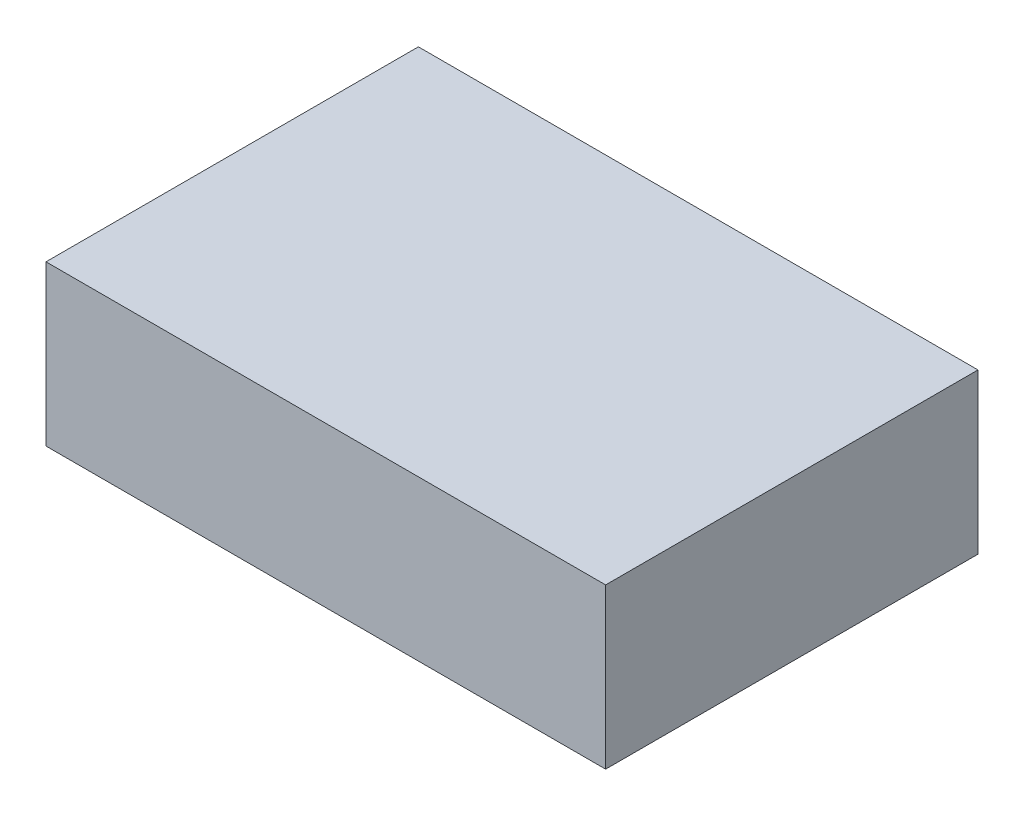
ISO-10303-21;
HEADER;
FILE_DESCRIPTION(('STEP AP214'),'2;1');
FILE_NAME('part.step','',(''),(''),'','','');
FILE_SCHEMA(('AUTOMOTIVE_DESIGN { 1 0 10303 214 1 1 1 1 }'));
ENDSEC;
DATA;
#1=APPLICATION_CONTEXT('core data for automotive mechanical design processes');
#2=APPLICATION_PROTOCOL_DEFINITION('international standard','automotive_design',2000,#1);
#3=PRODUCT_CONTEXT('',#1,'mechanical');
#4=PRODUCT('Part','Part','',(#3));
#5=PRODUCT_RELATED_PRODUCT_CATEGORY('part','',(#4));
#6=PRODUCT_DEFINITION_FORMATION('','',#4);
#7=PRODUCT_DEFINITION_CONTEXT('part definition',#1,'design');
#8=PRODUCT_DEFINITION('design','',#6,#7);
#9=PRODUCT_DEFINITION_SHAPE('','',#8);
#10=(LENGTH_UNIT() NAMED_UNIT(*) SI_UNIT(.MILLI.,.METRE.));
#11=(NAMED_UNIT(*) PLANE_ANGLE_UNIT() SI_UNIT($,.RADIAN.));
#12=(NAMED_UNIT(*) SI_UNIT($,.STERADIAN.) SOLID_ANGLE_UNIT());
#13=UNCERTAINTY_MEASURE_WITH_UNIT(LENGTH_MEASURE(1.E-05),#10,'distance_accuracy_value','');
#14=(GEOMETRIC_REPRESENTATION_CONTEXT(3) GLOBAL_UNCERTAINTY_ASSIGNED_CONTEXT((#13)) GLOBAL_UNIT_ASSIGNED_CONTEXT((#10,
#11,#12)) REPRESENTATION_CONTEXT('',''));
#15=CARTESIAN_POINT('',(0.,0.,0.));
#16=DIRECTION('',(0.,0.,1.));
#17=DIRECTION('',(1.,0.,0.));
#18=AXIS2_PLACEMENT_3D('',#15,#16,#17);
#19=CARTESIAN_POINT('',(26.3,15.,-17.5));
#20=DIRECTION('',(-1.,0.,0.));
#21=DIRECTION('',(0.,0.,1.));
#22=AXIS2_PLACEMENT_3D('',#19,#20,#21);
#23=PLANE('',#22);
#24=DIRECTION('',(0.,0.,-1.));
#25=VECTOR('',#24,1.);
#26=CARTESIAN_POINT('',(26.3,0.,-17.5));
#27=LINE('',#26,#25);
#28=CARTESIAN_POINT('',(26.3,0.,17.5));
#29=VERTEX_POINT('',#28);
#30=CARTESIAN_POINT('',(26.3,0.,-17.5));
#31=VERTEX_POINT('',#30);
#32=EDGE_CURVE('E95',#29,#31,#27,.T.);
#33=ORIENTED_EDGE('',*,*,#32,.T.);
#34=DIRECTION('',(0.,-1.,0.));
#35=VECTOR('',#34,1.);
#36=CARTESIAN_POINT('',(26.3,15.,-17.5));
#37=LINE('',#36,#35);
#38=CARTESIAN_POINT('',(26.3,15.,-17.5));
#39=VERTEX_POINT('',#38);
#40=EDGE_CURVE('E11',#39,#31,#37,.T.);
#41=ORIENTED_EDGE('',*,*,#40,.F.);
#42=DIRECTION('',(0.,0.,-1.));
#43=VECTOR('',#42,1.);
#44=CARTESIAN_POINT('',(26.3,15.,-17.5));
#45=LINE('',#44,#43);
#46=CARTESIAN_POINT('',(26.3,15.,17.5));
#47=VERTEX_POINT('',#46);
#48=EDGE_CURVE('E83',#47,#39,#45,.T.);
#49=ORIENTED_EDGE('',*,*,#48,.F.);
#50=DIRECTION('',(0.,-1.,0.));
#51=VECTOR('',#50,1.);
#52=CARTESIAN_POINT('',(26.3,15.,17.5));
#53=LINE('',#52,#51);
#54=EDGE_CURVE('E91',#47,#29,#53,.T.);
#55=ORIENTED_EDGE('',*,*,#54,.T.);
#56=EDGE_LOOP('',(#33,#41,#49,#55));
#57=FACE_BOUND('',#56,.T.);
#58=ADVANCED_FACE('F32',(#57),#23,.F.);
#59=CARTESIAN_POINT('',(-26.3,15.,-17.5));
#60=DIRECTION('',(0.,0.,1.));
#61=DIRECTION('',(1.,0.,0.));
#62=AXIS2_PLACEMENT_3D('',#59,#60,#61);
#63=PLANE('',#62);
#64=DIRECTION('',(-1.,0.,0.));
#65=VECTOR('',#64,1.);
#66=CARTESIAN_POINT('',(-26.3,0.,-17.5));
#67=LINE('',#66,#65);
#68=CARTESIAN_POINT('',(-26.3,0.,-17.5));
#69=VERTEX_POINT('',#68);
#70=EDGE_CURVE('E87',#31,#69,#67,.T.);
#71=ORIENTED_EDGE('',*,*,#70,.T.);
#72=DIRECTION('',(0.,-1.,0.));
#73=VECTOR('',#72,1.);
#74=CARTESIAN_POINT('',(-26.3,15.,-17.5));
#75=LINE('',#74,#73);
#76=CARTESIAN_POINT('',(-26.3,15.,-17.5));
#77=VERTEX_POINT('',#76);
#78=EDGE_CURVE('E40',#77,#69,#75,.T.);
#79=ORIENTED_EDGE('',*,*,#78,.F.);
#80=DIRECTION('',(-1.,0.,0.));
#81=VECTOR('',#80,1.);
#82=CARTESIAN_POINT('',(-26.3,15.,-17.5));
#83=LINE('',#82,#81);
#84=EDGE_CURVE('E78',#39,#77,#83,.T.);
#85=ORIENTED_EDGE('',*,*,#84,.F.);
#86=ORIENTED_EDGE('',*,*,#40,.T.);
#87=EDGE_LOOP('',(#71,#79,#85,#86));
#88=FACE_BOUND('',#87,.T.);
#89=ADVANCED_FACE('F86',(#88),#63,.F.);
#90=CARTESIAN_POINT('',(-26.3,15.,-17.5));
#91=DIRECTION('',(1.,0.,0.));
#92=DIRECTION('',(0.,0.,-1.));
#93=AXIS2_PLACEMENT_3D('',#90,#91,#92);
#94=PLANE('',#93);
#95=DIRECTION('',(0.,0.,1.));
#96=VECTOR('',#95,1.);
#97=CARTESIAN_POINT('',(-26.3,0.,-17.5));
#98=LINE('',#97,#96);
#99=CARTESIAN_POINT('',(-26.3,0.,17.5));
#100=VERTEX_POINT('',#99);
#101=EDGE_CURVE('E65',#69,#100,#98,.T.);
#102=ORIENTED_EDGE('',*,*,#101,.T.);
#103=DIRECTION('',(0.,-1.,0.));
#104=VECTOR('',#103,1.);
#105=CARTESIAN_POINT('',(-26.3,15.,17.5));
#106=LINE('',#105,#104);
#107=CARTESIAN_POINT('',(-26.3,15.,17.5));
#108=VERTEX_POINT('',#107);
#109=EDGE_CURVE('E88',#108,#100,#106,.T.);
#110=ORIENTED_EDGE('',*,*,#109,.F.);
#111=DIRECTION('',(0.,0.,1.));
#112=VECTOR('',#111,1.);
#113=CARTESIAN_POINT('',(-26.3,15.,-17.5));
#114=LINE('',#113,#112);
#115=EDGE_CURVE('E81',#77,#108,#114,.T.);
#116=ORIENTED_EDGE('',*,*,#115,.F.);
#117=ORIENTED_EDGE('',*,*,#78,.T.);
#118=EDGE_LOOP('',(#102,#110,#116,#117));
#119=FACE_BOUND('',#118,.T.);
#120=ADVANCED_FACE('F89',(#119),#94,.F.);
#121=CARTESIAN_POINT('',(-26.3,15.,17.5));
#122=DIRECTION('',(0.,0.,-1.));
#123=DIRECTION('',(-1.,0.,0.));
#124=AXIS2_PLACEMENT_3D('',#121,#122,#123);
#125=PLANE('',#124);
#126=DIRECTION('',(1.,0.,0.));
#127=VECTOR('',#126,1.);
#128=CARTESIAN_POINT('',(-26.3,0.,17.5));
#129=LINE('',#128,#127);
#130=EDGE_CURVE('E71',#100,#29,#129,.T.);
#131=ORIENTED_EDGE('',*,*,#130,.T.);
#132=ORIENTED_EDGE('',*,*,#54,.F.);
#133=DIRECTION('',(1.,0.,0.));
#134=VECTOR('',#133,1.);
#135=CARTESIAN_POINT('',(-26.3,15.,17.5));
#136=LINE('',#135,#134);
#137=EDGE_CURVE('E48',#108,#47,#136,.T.);
#138=ORIENTED_EDGE('',*,*,#137,.F.);
#139=ORIENTED_EDGE('',*,*,#109,.T.);
#140=EDGE_LOOP('',(#131,#132,#138,#139));
#141=FACE_BOUND('',#140,.T.);
#142=ADVANCED_FACE('F102',(#141),#125,.F.);
#143=CARTESIAN_POINT('',(0.,15.,0.));
#144=DIRECTION('',(0.,1.,0.));
#145=DIRECTION('',(0.,0.,1.));
#146=AXIS2_PLACEMENT_3D('',#143,#144,#145);
#147=PLANE('',#146);
#148=ORIENTED_EDGE('',*,*,#48,.T.);
#149=ORIENTED_EDGE('',*,*,#84,.T.);
#150=ORIENTED_EDGE('',*,*,#115,.T.);
#151=ORIENTED_EDGE('',*,*,#137,.T.);
#152=EDGE_LOOP('',(#148,#149,#150,#151));
#153=FACE_BOUND('',#152,.T.);
#154=ADVANCED_FACE('F79',(#153),#147,.T.);
#155=CARTESIAN_POINT('',(0.,0.,0.));
#156=DIRECTION('',(0.,1.,0.));
#157=DIRECTION('',(0.,0.,1.));
#158=AXIS2_PLACEMENT_3D('',#155,#156,#157);
#159=PLANE('',#158);
#160=ORIENTED_EDGE('',*,*,#32,.F.);
#161=ORIENTED_EDGE('',*,*,#130,.F.);
#162=ORIENTED_EDGE('',*,*,#101,.F.);
#163=ORIENTED_EDGE('',*,*,#70,.F.);
#164=EDGE_LOOP('',(#160,#161,#162,#163));
#165=FACE_BOUND('',#164,.T.);
#166=ADVANCED_FACE('F105',(#165),#159,.F.);
#167=CLOSED_SHELL('',(#58,#89,#120,#142,#154,#166));
#168=MANIFOLD_SOLID_BREP('B2',#167);
#169=ADVANCED_BREP_SHAPE_REPRESENTATION('',(#18,#168),#14);
#170=SHAPE_DEFINITION_REPRESENTATION(#9,#169);
ENDSEC;
END-ISO-10303-21;
